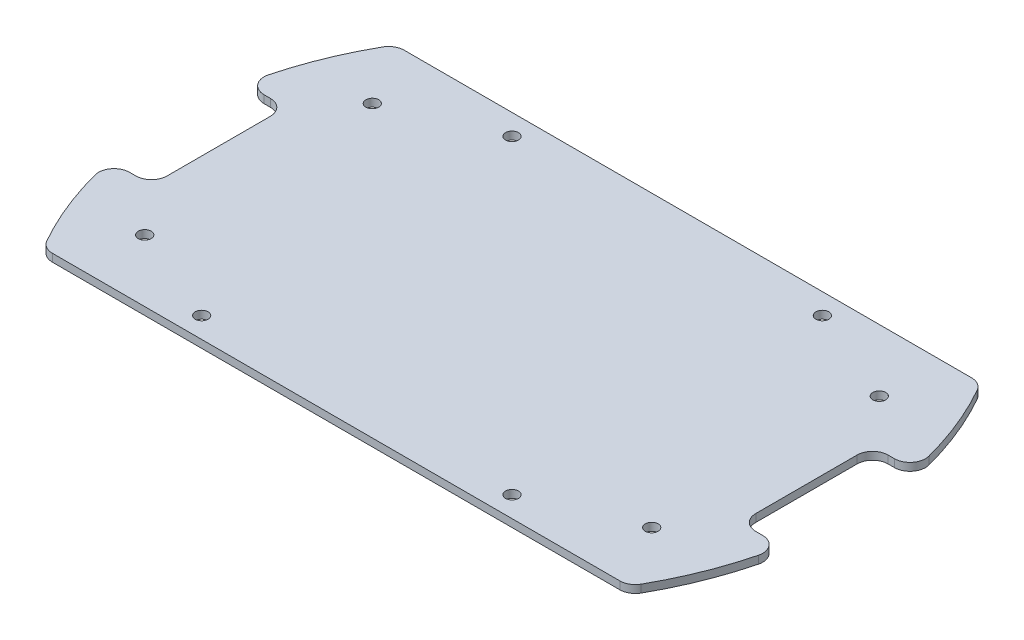
ISO-10303-21;
HEADER;
FILE_DESCRIPTION(('STEP AP214'),'2;1');
FILE_NAME('part.step','',(''),(''),'','','');
FILE_SCHEMA(('AUTOMOTIVE_DESIGN { 1 0 10303 214 1 1 1 1 }'));
ENDSEC;
DATA;
#1=APPLICATION_CONTEXT('core data for automotive mechanical design processes');
#2=APPLICATION_PROTOCOL_DEFINITION('international standard','automotive_design',2000,#1);
#3=PRODUCT_CONTEXT('',#1,'mechanical');
#4=PRODUCT('Part','Part','',(#3));
#5=PRODUCT_RELATED_PRODUCT_CATEGORY('part','',(#4));
#6=PRODUCT_DEFINITION_FORMATION('','',#4);
#7=PRODUCT_DEFINITION_CONTEXT('part definition',#1,'design');
#8=PRODUCT_DEFINITION('design','',#6,#7);
#9=PRODUCT_DEFINITION_SHAPE('','',#8);
#10=(LENGTH_UNIT() NAMED_UNIT(*) SI_UNIT(.MILLI.,.METRE.));
#11=(NAMED_UNIT(*) PLANE_ANGLE_UNIT() SI_UNIT($,.RADIAN.));
#12=(NAMED_UNIT(*) SI_UNIT($,.STERADIAN.) SOLID_ANGLE_UNIT());
#13=UNCERTAINTY_MEASURE_WITH_UNIT(LENGTH_MEASURE(1.E-05),#10,'distance_accuracy_value','');
#14=(GEOMETRIC_REPRESENTATION_CONTEXT(3) GLOBAL_UNCERTAINTY_ASSIGNED_CONTEXT((#13)) GLOBAL_UNIT_ASSIGNED_CONTEXT((#10,
#11,#12)) REPRESENTATION_CONTEXT('',''));
#15=CARTESIAN_POINT('',(0.,0.,0.));
#16=DIRECTION('',(0.,0.,1.));
#17=DIRECTION('',(1.,0.,0.));
#18=AXIS2_PLACEMENT_3D('',#15,#16,#17);
#19=CARTESIAN_POINT('',(-56.7070320753471,1.5,0.));
#20=DIRECTION('',(1.,0.,0.));
#21=DIRECTION('',(0.,0.,-1.));
#22=AXIS2_PLACEMENT_3D('',#19,#20,#21);
#23=PLANE('',#22);
#24=DIRECTION('',(0.,0.,1.));
#25=VECTOR('',#24,1.);
#26=CARTESIAN_POINT('',(-56.7070320753471,0.,0.));
#27=LINE('',#26,#25);
#28=CARTESIAN_POINT('',(-56.7070320753471,0.,-9.99999999999999));
#29=VERTEX_POINT('',#28);
#30=CARTESIAN_POINT('',(-56.7070320753471,0.,9.98328326306578));
#31=VERTEX_POINT('',#30);
#32=EDGE_CURVE('E327',#29,#31,#27,.T.);
#33=ORIENTED_EDGE('',*,*,#32,.T.);
#34=DIRECTION('',(0.,-1.,0.));
#35=VECTOR('',#34,1.);
#36=CARTESIAN_POINT('',(-56.7070320753471,1.5,9.98328326306578));
#37=LINE('',#36,#35);
#38=CARTESIAN_POINT('',(-56.7070320753471,1.5,9.98328326306578));
#39=VERTEX_POINT('',#38);
#40=EDGE_CURVE('E302',#31,#39,#37,.F.);
#41=ORIENTED_EDGE('',*,*,#40,.T.);
#42=DIRECTION('',(0.,0.,1.));
#43=VECTOR('',#42,1.);
#44=CARTESIAN_POINT('',(-56.7070320753471,1.5,0.));
#45=LINE('',#44,#43);
#46=CARTESIAN_POINT('',(-56.7070320753471,1.5,-9.99999999999999));
#47=VERTEX_POINT('',#46);
#48=EDGE_CURVE('E332',#47,#39,#45,.T.);
#49=ORIENTED_EDGE('',*,*,#48,.F.);
#50=DIRECTION('',(0.,-1.,0.));
#51=VECTOR('',#50,1.);
#52=CARTESIAN_POINT('',(-56.7070320753471,0.,-9.99999999999999));
#53=LINE('',#52,#51);
#54=EDGE_CURVE('E299',#47,#29,#53,.T.);
#55=ORIENTED_EDGE('',*,*,#54,.T.);
#56=EDGE_LOOP('',(#33,#41,#49,#55));
#57=FACE_BOUND('',#56,.T.);
#58=ADVANCED_FACE('F35',(#57),#23,.F.);
#59=CARTESIAN_POINT('',(0.0426976868972404,1.5,12.7837358563144));
#60=DIRECTION('',(-0.00333998208503997,0.,-0.99999442224428));
#61=DIRECTION('',(-0.99999442224428,0.,0.00333998208503997));
#62=AXIS2_PLACEMENT_3D('',#59,#60,#61);
#63=PLANE('',#62);
#64=DIRECTION('',(0.99999442224428,0.,-0.00333998208503997));
#65=VECTOR('',#64,1.);
#66=CARTESIAN_POINT('',(0.0426976868972404,0.,12.7837358563144));
#67=LINE('',#66,#65);
#68=CARTESIAN_POINT('',(-60.9477108585727,0.,12.987443864449));
#69=VERTEX_POINT('',#68);
#70=CARTESIAN_POINT('',(-59.697012129092,0.,12.9832665297986));
#71=VERTEX_POINT('',#70);
#72=EDGE_CURVE('E372',#69,#71,#67,.T.);
#73=ORIENTED_EDGE('',*,*,#72,.F.);
#74=DIRECTION('',(0.,1.,0.));
#75=VECTOR('',#74,1.);
#76=CARTESIAN_POINT('',(-60.9477108585727,1.5,12.987443864449));
#77=LINE('',#76,#75);
#78=CARTESIAN_POINT('',(-60.9477108585727,1.5,12.987443864449));
#79=VERTEX_POINT('',#78);
#80=EDGE_CURVE('E297',#69,#79,#77,.T.);
#81=ORIENTED_EDGE('',*,*,#80,.T.);
#82=DIRECTION('',(0.99999442224428,0.,-0.00333998208503997));
#83=VECTOR('',#82,1.);
#84=CARTESIAN_POINT('',(0.0426976868972404,1.5,12.7837358563144));
#85=LINE('',#84,#83);
#86=CARTESIAN_POINT('',(-59.697012129092,1.5,12.9832665297986));
#87=VERTEX_POINT('',#86);
#88=EDGE_CURVE('E344',#79,#87,#85,.T.);
#89=ORIENTED_EDGE('',*,*,#88,.T.);
#90=DIRECTION('',(0.,-1.,0.));
#91=VECTOR('',#90,1.);
#92=CARTESIAN_POINT('',(-59.697012129092,1.5,12.9832665297986));
#93=LINE('',#92,#91);
#94=EDGE_CURVE('E294',#87,#71,#93,.T.);
#95=ORIENTED_EDGE('',*,*,#94,.T.);
#96=EDGE_LOOP('',(#73,#81,#89,#95));
#97=FACE_BOUND('',#96,.T.);
#98=ADVANCED_FACE('F451',(#97),#63,.T.);
#99=CARTESIAN_POINT('',(0.,1.5,0.));
#100=DIRECTION('',(0.,-1.,0.));
#101=DIRECTION('',(0.,0.,-1.));
#102=AXIS2_PLACEMENT_3D('',#99,#100,#101);
#103=CYLINDRICAL_SURFACE('',#102,66.);
#104=CARTESIAN_POINT('',(0.,0.,0.));
#105=DIRECTION('',(0.,1.,0.));
#106=DIRECTION('',(0.,0.,1.));
#107=AXIS2_PLACEMENT_3D('',#104,#105,#106);
#108=CIRCLE('',#107,66.);
#109=CARTESIAN_POINT('',(-63.839485717666,0.,16.7487331850477));
#110=VERTEX_POINT('',#109);
#111=CARTESIAN_POINT('',(-57.4569147462183,0.,32.4761904761905));
#112=VERTEX_POINT('',#111);
#113=EDGE_CURVE('E376',#110,#112,#108,.T.);
#114=ORIENTED_EDGE('',*,*,#113,.T.);
#115=DIRECTION('',(0.,-1.,0.));
#116=VECTOR('',#115,1.);
#117=CARTESIAN_POINT('',(-57.4569147462183,1.5,32.4761904761905));
#118=LINE('',#117,#116);
#119=CARTESIAN_POINT('',(-57.4569147462183,1.5,32.4761904761905));
#120=VERTEX_POINT('',#119);
#121=EDGE_CURVE('E292',#112,#120,#118,.F.);
#122=ORIENTED_EDGE('',*,*,#121,.T.);
#123=CARTESIAN_POINT('',(0.,1.5,0.));
#124=DIRECTION('',(0.,1.,0.));
#125=DIRECTION('',(0.,0.,1.));
#126=AXIS2_PLACEMENT_3D('',#123,#124,#125);
#127=CIRCLE('',#126,66.);
#128=CARTESIAN_POINT('',(-63.839485717666,1.5,16.7487331850477));
#129=VERTEX_POINT('',#128);
#130=EDGE_CURVE('E347',#129,#120,#127,.T.);
#131=ORIENTED_EDGE('',*,*,#130,.F.);
#132=DIRECTION('',(0.,-1.,0.));
#133=VECTOR('',#132,1.);
#134=CARTESIAN_POINT('',(-63.839485717666,1.5,16.7487331850477));
#135=LINE('',#134,#133);
#136=EDGE_CURVE('E289',#129,#110,#135,.T.);
#137=ORIENTED_EDGE('',*,*,#136,.T.);
#138=EDGE_LOOP('',(#114,#122,#131,#137));
#139=FACE_BOUND('',#138,.T.);
#140=ADVANCED_FACE('F456',(#139),#103,.T.);
#141=CARTESIAN_POINT('',(0.,1.5,34.));
#142=DIRECTION('',(0.,0.,-1.));
#143=DIRECTION('',(-1.,0.,0.));
#144=AXIS2_PLACEMENT_3D('',#141,#142,#143);
#145=PLANE('',#144);
#146=DIRECTION('',(1.,0.,0.));
#147=VECTOR('',#146,1.);
#148=CARTESIAN_POINT('',(0.,0.,34.));
#149=LINE('',#148,#147);
#150=CARTESIAN_POINT('',(-54.8452368032084,0.,34.));
#151=VERTEX_POINT('',#150);
#152=CARTESIAN_POINT('',(54.8452368032084,0.,34.));
#153=VERTEX_POINT('',#152);
#154=EDGE_CURVE('E380',#151,#153,#149,.T.);
#155=ORIENTED_EDGE('',*,*,#154,.T.);
#156=DIRECTION('',(0.,-1.,0.));
#157=VECTOR('',#156,1.);
#158=CARTESIAN_POINT('',(54.8452368032084,1.5,34.));
#159=LINE('',#158,#157);
#160=CARTESIAN_POINT('',(54.8452368032084,1.5,34.));
#161=VERTEX_POINT('',#160);
#162=EDGE_CURVE('E287',#153,#161,#159,.F.);
#163=ORIENTED_EDGE('',*,*,#162,.T.);
#164=DIRECTION('',(1.,0.,0.));
#165=VECTOR('',#164,1.);
#166=CARTESIAN_POINT('',(0.,1.5,34.));
#167=LINE('',#166,#165);
#168=CARTESIAN_POINT('',(-54.8452368032084,1.5,34.));
#169=VERTEX_POINT('',#168);
#170=EDGE_CURVE('E359',#169,#161,#167,.T.);
#171=ORIENTED_EDGE('',*,*,#170,.F.);
#172=DIRECTION('',(0.,-1.,0.));
#173=VECTOR('',#172,1.);
#174=CARTESIAN_POINT('',(-54.8452368032084,1.5,34.));
#175=LINE('',#174,#173);
#176=EDGE_CURVE('E284',#169,#151,#175,.T.);
#177=ORIENTED_EDGE('',*,*,#176,.T.);
#178=EDGE_LOOP('',(#155,#163,#171,#177));
#179=FACE_BOUND('',#178,.T.);
#180=ADVANCED_FACE('F552',(#179),#145,.F.);
#181=CARTESIAN_POINT('',(0.,1.5,0.));
#182=DIRECTION('',(0.,-1.,0.));
#183=DIRECTION('',(0.,0.,-1.));
#184=AXIS2_PLACEMENT_3D('',#181,#182,#183);
#185=CYLINDRICAL_SURFACE('',#184,66.);
#186=CARTESIAN_POINT('',(0.,0.,0.));
#187=DIRECTION('',(0.,1.,0.));
#188=DIRECTION('',(0.,0.,1.));
#189=AXIS2_PLACEMENT_3D('',#186,#187,#188);
#190=CIRCLE('',#189,66.);
#191=CARTESIAN_POINT('',(57.4569147462183,0.,32.4761904761905));
#192=VERTEX_POINT('',#191);
#193=CARTESIAN_POINT('',(63.9499417109376,0.,16.3219164060989));
#194=VERTEX_POINT('',#193);
#195=EDGE_CURVE('E383',#192,#194,#190,.T.);
#196=ORIENTED_EDGE('',*,*,#195,.T.);
#197=DIRECTION('',(0.,-1.,0.));
#198=VECTOR('',#197,1.);
#199=CARTESIAN_POINT('',(63.9499417109376,1.5,16.3219164060989));
#200=LINE('',#199,#198);
#201=CARTESIAN_POINT('',(63.9499417109376,1.5,16.3219164060989));
#202=VERTEX_POINT('',#201);
#203=EDGE_CURVE('E282',#194,#202,#200,.F.);
#204=ORIENTED_EDGE('',*,*,#203,.T.);
#205=CARTESIAN_POINT('',(0.,1.5,0.));
#206=DIRECTION('',(0.,1.,0.));
#207=DIRECTION('',(0.,0.,1.));
#208=AXIS2_PLACEMENT_3D('',#205,#206,#207);
#209=CIRCLE('',#208,66.);
#210=CARTESIAN_POINT('',(57.4569147462183,1.5,32.4761904761905));
#211=VERTEX_POINT('',#210);
#212=EDGE_CURVE('E356',#211,#202,#209,.T.);
#213=ORIENTED_EDGE('',*,*,#212,.F.);
#214=DIRECTION('',(0.,-1.,0.));
#215=VECTOR('',#214,1.);
#216=CARTESIAN_POINT('',(57.4569147462183,1.5,32.4761904761905));
#217=LINE('',#216,#215);
#218=EDGE_CURVE('E279',#211,#192,#217,.T.);
#219=ORIENTED_EDGE('',*,*,#218,.T.);
#220=EDGE_LOOP('',(#196,#204,#213,#219));
#221=FACE_BOUND('',#220,.T.);
#222=ADVANCED_FACE('F545',(#221),#185,.T.);
#223=CARTESIAN_POINT('',(59.7170520216022,0.,12.5844234701843));
#224=VERTEX_POINT('',#223);
#225=CARTESIAN_POINT('',(61.0331062323672,0.,12.5800278481797));
#226=VERTEX_POINT('',#225);
#227=EDGE_CURVE('E377',#224,#226,#67,.T.);
#228=ORIENTED_EDGE('',*,*,#227,.F.);
#229=DIRECTION('',(0.,-1.,0.));
#230=VECTOR('',#229,1.);
#231=CARTESIAN_POINT('',(59.7170520216022,1.5,12.5844234701843));
#232=LINE('',#231,#230);
#233=CARTESIAN_POINT('',(59.7170520216022,1.5,12.5844234701843));
#234=VERTEX_POINT('',#233);
#235=EDGE_CURVE('E277',#224,#234,#232,.F.);
#236=ORIENTED_EDGE('',*,*,#235,.T.);
#237=CARTESIAN_POINT('',(61.0331062323672,1.5,12.5800278481797));
#238=VERTEX_POINT('',#237);
#239=EDGE_CURVE('E349',#234,#238,#85,.T.);
#240=ORIENTED_EDGE('',*,*,#239,.T.);
#241=DIRECTION('',(0.,1.,0.));
#242=VECTOR('',#241,1.);
#243=CARTESIAN_POINT('',(61.0331062323672,0.,12.5800278481797));
#244=LINE('',#243,#242);
#245=EDGE_CURVE('E274',#238,#226,#244,.F.);
#246=ORIENTED_EDGE('',*,*,#245,.T.);
#247=EDGE_LOOP('',(#228,#236,#240,#246));
#248=FACE_BOUND('',#247,.T.);
#249=ADVANCED_FACE('F459',(#248),#63,.T.);
#250=CARTESIAN_POINT('',(56.7070320753471,1.5,0.));
#251=DIRECTION('',(1.,0.,0.));
#252=DIRECTION('',(0.,0.,-1.));
#253=AXIS2_PLACEMENT_3D('',#250,#251,#252);
#254=PLANE('',#253);
#255=DIRECTION('',(0.,0.,1.));
#256=VECTOR('',#255,1.);
#257=CARTESIAN_POINT('',(56.7070320753471,0.,0.));
#258=LINE('',#257,#256);
#259=CARTESIAN_POINT('',(56.7070320753471,0.,-9.99999999999999));
#260=VERTEX_POINT('',#259);
#261=CARTESIAN_POINT('',(56.7070320753471,0.,9.58444020345149));
#262=VERTEX_POINT('',#261);
#263=EDGE_CURVE('E386',#260,#262,#258,.T.);
#264=ORIENTED_EDGE('',*,*,#263,.F.);
#265=DIRECTION('',(0.,-1.,0.));
#266=VECTOR('',#265,1.);
#267=CARTESIAN_POINT('',(56.7070320753471,1.5,-9.99999999999999));
#268=LINE('',#267,#266);
#269=CARTESIAN_POINT('',(56.7070320753471,1.5,-9.99999999999999));
#270=VERTEX_POINT('',#269);
#271=EDGE_CURVE('E272',#260,#270,#268,.F.);
#272=ORIENTED_EDGE('',*,*,#271,.T.);
#273=DIRECTION('',(0.,0.,1.));
#274=VECTOR('',#273,1.);
#275=CARTESIAN_POINT('',(56.7070320753471,1.5,0.));
#276=LINE('',#275,#274);
#277=CARTESIAN_POINT('',(56.7070320753471,1.5,9.58444020345149));
#278=VERTEX_POINT('',#277);
#279=EDGE_CURVE('E355',#270,#278,#276,.T.);
#280=ORIENTED_EDGE('',*,*,#279,.T.);
#281=DIRECTION('',(0.,-1.,0.));
#282=VECTOR('',#281,1.);
#283=CARTESIAN_POINT('',(56.7070320753471,0.,9.58444020345149));
#284=LINE('',#283,#282);
#285=EDGE_CURVE('E269',#278,#262,#284,.T.);
#286=ORIENTED_EDGE('',*,*,#285,.T.);
#287=EDGE_LOOP('',(#264,#272,#280,#286));
#288=FACE_BOUND('',#287,.T.);
#289=ADVANCED_FACE('F531',(#288),#254,.T.);
#290=CARTESIAN_POINT('',(0.,1.5,-13.));
#291=DIRECTION('',(0.,0.,-1.));
#292=DIRECTION('',(-1.,0.,0.));
#293=AXIS2_PLACEMENT_3D('',#290,#291,#292);
#294=PLANE('',#293);
#295=DIRECTION('',(1.,0.,0.));
#296=VECTOR('',#295,1.);
#297=CARTESIAN_POINT('',(0.,0.,-13.));
#298=LINE('',#297,#296);
#299=CARTESIAN_POINT('',(59.7070320753471,0.,-13.));
#300=VERTEX_POINT('',#299);
#301=CARTESIAN_POINT('',(60.9343909463285,0.,-13.));
#302=VERTEX_POINT('',#301);
#303=EDGE_CURVE('E334',#300,#302,#298,.T.);
#304=ORIENTED_EDGE('',*,*,#303,.T.);
#305=DIRECTION('',(0.,-1.,0.));
#306=VECTOR('',#305,1.);
#307=CARTESIAN_POINT('',(60.9343909463285,1.5,-13.));
#308=LINE('',#307,#306);
#309=CARTESIAN_POINT('',(60.9343909463285,1.5,-13.));
#310=VERTEX_POINT('',#309);
#311=EDGE_CURVE('E267',#302,#310,#308,.F.);
#312=ORIENTED_EDGE('',*,*,#311,.T.);
#313=DIRECTION('',(1.,0.,0.));
#314=VECTOR('',#313,1.);
#315=CARTESIAN_POINT('',(0.,1.5,-13.));
#316=LINE('',#315,#314);
#317=CARTESIAN_POINT('',(59.7070320753471,1.5,-13.));
#318=VERTEX_POINT('',#317);
#319=EDGE_CURVE('E228',#318,#310,#316,.T.);
#320=ORIENTED_EDGE('',*,*,#319,.F.);
#321=DIRECTION('',(0.,-1.,0.));
#322=VECTOR('',#321,1.);
#323=CARTESIAN_POINT('',(59.7070320753471,1.5,-13.));
#324=LINE('',#323,#322);
#325=EDGE_CURVE('E264',#318,#300,#324,.T.);
#326=ORIENTED_EDGE('',*,*,#325,.T.);
#327=EDGE_LOOP('',(#304,#312,#320,#326));
#328=FACE_BOUND('',#327,.T.);
#329=ADVANCED_FACE('F523',(#328),#294,.F.);
#330=CARTESIAN_POINT('',(0.,1.5,0.));
#331=DIRECTION('',(0.,-1.,0.));
#332=DIRECTION('',(0.,0.,-1.));
#333=AXIS2_PLACEMENT_3D('',#330,#331,#332);
#334=CYLINDRICAL_SURFACE('',#333,66.);
#335=CARTESIAN_POINT('',(0.,0.,0.));
#336=DIRECTION('',(0.,1.,0.));
#337=DIRECTION('',(0.,0.,1.));
#338=AXIS2_PLACEMENT_3D('',#335,#336,#337);
#339=CIRCLE('',#338,66.);
#340=CARTESIAN_POINT('',(63.8360286104394,0.,-16.7619047619048));
#341=VERTEX_POINT('',#340);
#342=CARTESIAN_POINT('',(57.4569147462183,0.,-32.4761904761905));
#343=VERTEX_POINT('',#342);
#344=EDGE_CURVE('E218',#341,#343,#339,.T.);
#345=ORIENTED_EDGE('',*,*,#344,.T.);
#346=DIRECTION('',(0.,-1.,0.));
#347=VECTOR('',#346,1.);
#348=CARTESIAN_POINT('',(57.4569147462183,1.5,-32.4761904761905));
#349=LINE('',#348,#347);
#350=CARTESIAN_POINT('',(57.4569147462183,1.5,-32.4761904761905));
#351=VERTEX_POINT('',#350);
#352=EDGE_CURVE('E248',#343,#351,#349,.F.);
#353=ORIENTED_EDGE('',*,*,#352,.T.);
#354=CARTESIAN_POINT('',(0.,1.5,0.));
#355=DIRECTION('',(0.,1.,0.));
#356=DIRECTION('',(0.,0.,1.));
#357=AXIS2_PLACEMENT_3D('',#354,#355,#356);
#358=CIRCLE('',#357,66.);
#359=CARTESIAN_POINT('',(63.8360286104394,1.5,-16.7619047619048));
#360=VERTEX_POINT('',#359);
#361=EDGE_CURVE('E366',#360,#351,#358,.T.);
#362=ORIENTED_EDGE('',*,*,#361,.F.);
#363=DIRECTION('',(0.,-1.,0.));
#364=VECTOR('',#363,1.);
#365=CARTESIAN_POINT('',(63.8360286104394,1.5,-16.7619047619048));
#366=LINE('',#365,#364);
#367=EDGE_CURVE('E245',#360,#341,#366,.T.);
#368=ORIENTED_EDGE('',*,*,#367,.T.);
#369=EDGE_LOOP('',(#345,#353,#362,#368));
#370=FACE_BOUND('',#369,.T.);
#371=ADVANCED_FACE('F516',(#370),#334,.T.);
#372=CARTESIAN_POINT('',(0.,1.5,-34.));
#373=DIRECTION('',(0.,0.,-1.));
#374=DIRECTION('',(-1.,0.,0.));
#375=AXIS2_PLACEMENT_3D('',#372,#373,#374);
#376=PLANE('',#375);
#377=DIRECTION('',(1.,0.,0.));
#378=VECTOR('',#377,1.);
#379=CARTESIAN_POINT('',(0.,1.5,-34.));
#380=LINE('',#379,#378);
#381=CARTESIAN_POINT('',(-54.8452368032084,1.5,-34.));
#382=VERTEX_POINT('',#381);
#383=CARTESIAN_POINT('',(54.8452368032084,1.5,-34.));
#384=VERTEX_POINT('',#383);
#385=EDGE_CURVE('E368',#382,#384,#380,.T.);
#386=ORIENTED_EDGE('',*,*,#385,.T.);
#387=DIRECTION('',(0.,1.,0.));
#388=VECTOR('',#387,1.);
#389=CARTESIAN_POINT('',(54.8452368032084,0.,-34.));
#390=LINE('',#389,#388);
#391=CARTESIAN_POINT('',(54.8452368032084,0.,-34.));
#392=VERTEX_POINT('',#391);
#393=EDGE_CURVE('E217',#384,#392,#390,.F.);
#394=ORIENTED_EDGE('',*,*,#393,.T.);
#395=DIRECTION('',(1.,0.,0.));
#396=VECTOR('',#395,1.);
#397=CARTESIAN_POINT('',(0.,0.,-34.));
#398=LINE('',#397,#396);
#399=CARTESIAN_POINT('',(-54.8452368032084,0.,-34.));
#400=VERTEX_POINT('',#399);
#401=EDGE_CURVE('E200',#400,#392,#398,.T.);
#402=ORIENTED_EDGE('',*,*,#401,.F.);
#403=DIRECTION('',(0.,1.,0.));
#404=VECTOR('',#403,1.);
#405=CARTESIAN_POINT('',(-54.8452368032084,1.5,-34.));
#406=LINE('',#405,#404);
#407=EDGE_CURVE('E214',#400,#382,#406,.T.);
#408=ORIENTED_EDGE('',*,*,#407,.T.);
#409=EDGE_LOOP('',(#386,#394,#402,#408));
#410=FACE_BOUND('',#409,.T.);
#411=ADVANCED_FACE('F213',(#410),#376,.T.);
#412=CARTESIAN_POINT('',(0.,1.5,0.));
#413=DIRECTION('',(0.,-1.,0.));
#414=DIRECTION('',(0.,0.,-1.));
#415=AXIS2_PLACEMENT_3D('',#412,#413,#414);
#416=CYLINDRICAL_SURFACE('',#415,66.);
#417=CARTESIAN_POINT('',(0.,1.5,0.));
#418=DIRECTION('',(0.,1.,0.));
#419=DIRECTION('',(0.,0.,1.));
#420=AXIS2_PLACEMENT_3D('',#417,#418,#419);
#421=CIRCLE('',#420,66.);
#422=CARTESIAN_POINT('',(-57.4569147462183,1.5,-32.4761904761905));
#423=VERTEX_POINT('',#422);
#424=CARTESIAN_POINT('',(-63.8360286104394,1.5,-16.7619047619048));
#425=VERTEX_POINT('',#424);
#426=EDGE_CURVE('E226',#423,#425,#421,.T.);
#427=ORIENTED_EDGE('',*,*,#426,.F.);
#428=DIRECTION('',(0.,-1.,0.));
#429=VECTOR('',#428,1.);
#430=CARTESIAN_POINT('',(-57.4569147462183,1.5,-32.4761904761905));
#431=LINE('',#430,#429);
#432=CARTESIAN_POINT('',(-57.4569147462183,0.,-32.4761904761905));
#433=VERTEX_POINT('',#432);
#434=EDGE_CURVE('E310',#423,#433,#431,.T.);
#435=ORIENTED_EDGE('',*,*,#434,.T.);
#436=CARTESIAN_POINT('',(0.,0.,0.));
#437=DIRECTION('',(0.,1.,0.));
#438=DIRECTION('',(0.,0.,1.));
#439=AXIS2_PLACEMENT_3D('',#436,#437,#438);
#440=CIRCLE('',#439,66.);
#441=CARTESIAN_POINT('',(-63.8360286104394,0.,-16.7619047619048));
#442=VERTEX_POINT('',#441);
#443=EDGE_CURVE('E202',#433,#442,#440,.T.);
#444=ORIENTED_EDGE('',*,*,#443,.T.);
#445=DIRECTION('',(0.,-1.,0.));
#446=VECTOR('',#445,1.);
#447=CARTESIAN_POINT('',(-63.8360286104394,1.5,-16.7619047619048));
#448=LINE('',#447,#446);
#449=EDGE_CURVE('E308',#442,#425,#448,.F.);
#450=ORIENTED_EDGE('',*,*,#449,.T.);
#451=EDGE_LOOP('',(#427,#435,#444,#450));
#452=FACE_BOUND('',#451,.T.);
#453=ADVANCED_FACE('F511',(#452),#416,.T.);
#454=CARTESIAN_POINT('',(-60.9343909463285,0.,-13.));
#455=VERTEX_POINT('',#454);
#456=CARTESIAN_POINT('',(-59.7070320753471,0.,-13.));
#457=VERTEX_POINT('',#456);
#458=EDGE_CURVE('E325',#455,#457,#298,.T.);
#459=ORIENTED_EDGE('',*,*,#458,.T.);
#460=DIRECTION('',(0.,-1.,0.));
#461=VECTOR('',#460,1.);
#462=CARTESIAN_POINT('',(-59.7070320753471,1.5,-13.));
#463=LINE('',#462,#461);
#464=CARTESIAN_POINT('',(-59.7070320753471,1.5,-13.));
#465=VERTEX_POINT('',#464);
#466=EDGE_CURVE('E50',#457,#465,#463,.F.);
#467=ORIENTED_EDGE('',*,*,#466,.T.);
#468=CARTESIAN_POINT('',(-60.9343909463285,1.5,-13.));
#469=VERTEX_POINT('',#468);
#470=EDGE_CURVE('E223',#469,#465,#316,.T.);
#471=ORIENTED_EDGE('',*,*,#470,.F.);
#472=DIRECTION('',(0.,-1.,0.));
#473=VECTOR('',#472,1.);
#474=CARTESIAN_POINT('',(-60.9343909463285,1.5,-13.));
#475=LINE('',#474,#473);
#476=EDGE_CURVE('E304',#469,#455,#475,.T.);
#477=ORIENTED_EDGE('',*,*,#476,.T.);
#478=EDGE_LOOP('',(#459,#467,#471,#477));
#479=FACE_BOUND('',#478,.T.);
#480=ADVANCED_FACE('F330',(#479),#294,.F.);
#481=CARTESIAN_POINT('',(0.,1.5,0.));
#482=DIRECTION('',(0.,1.,0.));
#483=DIRECTION('',(0.,0.,1.));
#484=AXIS2_PLACEMENT_3D('',#481,#482,#483);
#485=PLANE('',#484);
#486=CARTESIAN_POINT('',(49.,1.5,22.));
#487=DIRECTION('',(0.,1.,0.));
#488=DIRECTION('',(0.,0.,1.));
#489=AXIS2_PLACEMENT_3D('',#486,#487,#488);
#490=CIRCLE('',#489,1.25);
#491=CARTESIAN_POINT('',(49.,1.5,23.25));
#492=VERTEX_POINT('',#491);
#493=EDGE_CURVE('E793',#492,#492,#490,.T.);
#494=ORIENTED_EDGE('',*,*,#493,.F.);
#495=EDGE_LOOP('',(#494));
#496=FACE_BOUND('',#495,.T.);
#497=CARTESIAN_POINT('',(49.,1.5,-22.));
#498=DIRECTION('',(0.,1.,0.));
#499=DIRECTION('',(0.,0.,1.));
#500=AXIS2_PLACEMENT_3D('',#497,#498,#499);
#501=CIRCLE('',#500,1.25);
#502=CARTESIAN_POINT('',(49.,1.5,-20.75));
#503=VERTEX_POINT('',#502);
#504=EDGE_CURVE('E786',#503,#503,#501,.T.);
#505=ORIENTED_EDGE('',*,*,#504,.F.);
#506=EDGE_LOOP('',(#505));
#507=FACE_BOUND('',#506,.T.);
#508=CARTESIAN_POINT('',(-49.,1.5,22.));
#509=DIRECTION('',(0.,1.,0.));
#510=DIRECTION('',(0.,0.,1.));
#511=AXIS2_PLACEMENT_3D('',#508,#509,#510);
#512=CIRCLE('',#511,1.25);
#513=CARTESIAN_POINT('',(-49.,1.5,23.25));
#514=VERTEX_POINT('',#513);
#515=EDGE_CURVE('E415',#514,#514,#512,.T.);
#516=ORIENTED_EDGE('',*,*,#515,.F.);
#517=EDGE_LOOP('',(#516));
#518=FACE_BOUND('',#517,.T.);
#519=CARTESIAN_POINT('',(-49.,1.5,-22.));
#520=DIRECTION('',(0.,1.,0.));
#521=DIRECTION('',(0.,0.,1.));
#522=AXIS2_PLACEMENT_3D('',#519,#520,#521);
#523=CIRCLE('',#522,1.25);
#524=CARTESIAN_POINT('',(-49.,1.5,-20.75));
#525=VERTEX_POINT('',#524);
#526=EDGE_CURVE('E405',#525,#525,#523,.T.);
#527=ORIENTED_EDGE('',*,*,#526,.F.);
#528=EDGE_LOOP('',(#527));
#529=FACE_BOUND('',#528,.T.);
#530=CARTESIAN_POINT('',(-30.,1.5,-30.));
#531=DIRECTION('',(0.,1.,0.));
#532=DIRECTION('',(0.,0.,1.));
#533=AXIS2_PLACEMENT_3D('',#530,#531,#532);
#534=CIRCLE('',#533,1.25);
#535=CARTESIAN_POINT('',(-30.,1.5,-28.75));
#536=VERTEX_POINT('',#535);
#537=EDGE_CURVE('E402',#536,#536,#534,.T.);
#538=ORIENTED_EDGE('',*,*,#537,.F.);
#539=EDGE_LOOP('',(#538));
#540=FACE_BOUND('',#539,.T.);
#541=CARTESIAN_POINT('',(-29.9999999999983,1.5,30.));
#542=DIRECTION('',(0.,1.,0.));
#543=DIRECTION('',(0.,0.,1.));
#544=AXIS2_PLACEMENT_3D('',#541,#542,#543);
#545=CIRCLE('',#544,1.25);
#546=CARTESIAN_POINT('',(-29.9999999999983,1.5,31.25));
#547=VERTEX_POINT('',#546);
#548=EDGE_CURVE('E401',#547,#547,#545,.T.);
#549=ORIENTED_EDGE('',*,*,#548,.F.);
#550=EDGE_LOOP('',(#549));
#551=FACE_BOUND('',#550,.T.);
#552=CARTESIAN_POINT('',(30.,1.5,-30.0000000000017));
#553=DIRECTION('',(0.,1.,0.));
#554=DIRECTION('',(0.,0.,1.));
#555=AXIS2_PLACEMENT_3D('',#552,#553,#554);
#556=CIRCLE('',#555,1.25);
#557=CARTESIAN_POINT('',(30.,1.5,-28.7500000000017));
#558=VERTEX_POINT('',#557);
#559=EDGE_CURVE('E398',#558,#558,#556,.T.);
#560=ORIENTED_EDGE('',*,*,#559,.F.);
#561=EDGE_LOOP('',(#560));
#562=FACE_BOUND('',#561,.T.);
#563=CARTESIAN_POINT('',(30.0000000000017,1.5,29.9999999999983));
#564=DIRECTION('',(0.,1.,0.));
#565=DIRECTION('',(0.,0.,1.));
#566=AXIS2_PLACEMENT_3D('',#563,#564,#565);
#567=CIRCLE('',#566,1.25);
#568=CARTESIAN_POINT('',(30.0000000000017,1.5,31.2499999999983));
#569=VERTEX_POINT('',#568);
#570=EDGE_CURVE('E351',#569,#569,#567,.T.);
#571=ORIENTED_EDGE('',*,*,#570,.F.);
#572=EDGE_LOOP('',(#571));
#573=FACE_BOUND('',#572,.T.);
#574=ORIENTED_EDGE('',*,*,#361,.T.);
#575=CARTESIAN_POINT('',(54.8452368032084,1.5,-31.));
#576=DIRECTION('',(0.,1.,0.));
#577=DIRECTION('',(0.,0.,1.));
#578=AXIS2_PLACEMENT_3D('',#575,#576,#577);
#579=CIRCLE('',#578,3.);
#580=EDGE_CURVE('E262',#351,#384,#579,.T.);
#581=ORIENTED_EDGE('',*,*,#580,.T.);
#582=ORIENTED_EDGE('',*,*,#385,.F.);
#583=CARTESIAN_POINT('',(-54.8452368032084,1.5,-31.));
#584=DIRECTION('',(0.,1.,0.));
#585=DIRECTION('',(0.,0.,1.));
#586=AXIS2_PLACEMENT_3D('',#583,#584,#585);
#587=CIRCLE('',#586,3.);
#588=EDGE_CURVE('E222',#382,#423,#587,.T.);
#589=ORIENTED_EDGE('',*,*,#588,.T.);
#590=ORIENTED_EDGE('',*,*,#426,.T.);
#591=CARTESIAN_POINT('',(-60.9343909463285,1.5,-16.));
#592=DIRECTION('',(0.,1.,0.));
#593=DIRECTION('',(0.,0.,1.));
#594=AXIS2_PLACEMENT_3D('',#591,#592,#593);
#595=CIRCLE('',#594,3.);
#596=EDGE_CURVE('E57',#425,#469,#595,.T.);
#597=ORIENTED_EDGE('',*,*,#596,.T.);
#598=ORIENTED_EDGE('',*,*,#470,.T.);
#599=CARTESIAN_POINT('',(-59.7070320753471,1.5,-9.99999999999999));
#600=DIRECTION('',(0.,1.,0.));
#601=DIRECTION('',(0.,0.,1.));
#602=AXIS2_PLACEMENT_3D('',#599,#600,#601);
#603=CIRCLE('',#602,3.);
#604=EDGE_CURVE('E11',#465,#47,#603,.F.);
#605=ORIENTED_EDGE('',*,*,#604,.T.);
#606=ORIENTED_EDGE('',*,*,#48,.T.);
#607=CARTESIAN_POINT('',(-59.7070320753471,1.5,9.98328326306578));
#608=DIRECTION('',(0.,1.,0.));
#609=DIRECTION('',(0.,0.,1.));
#610=AXIS2_PLACEMENT_3D('',#607,#608,#609);
#611=CIRCLE('',#610,3.);
#612=EDGE_CURVE('E322',#39,#87,#611,.F.);
#613=ORIENTED_EDGE('',*,*,#612,.T.);
#614=ORIENTED_EDGE('',*,*,#88,.F.);
#615=CARTESIAN_POINT('',(-60.9376909123176,1.5,15.9874271311819));
#616=DIRECTION('',(0.,1.,0.));
#617=DIRECTION('',(0.,0.,1.));
#618=AXIS2_PLACEMENT_3D('',#615,#616,#617);
#619=CIRCLE('',#618,3.);
#620=EDGE_CURVE('E252',#79,#129,#619,.T.);
#621=ORIENTED_EDGE('',*,*,#620,.T.);
#622=ORIENTED_EDGE('',*,*,#130,.T.);
#623=CARTESIAN_POINT('',(-54.8452368032084,1.5,31.));
#624=DIRECTION('',(0.,1.,0.));
#625=DIRECTION('',(0.,0.,1.));
#626=AXIS2_PLACEMENT_3D('',#623,#624,#625);
#627=CIRCLE('',#626,3.);
#628=EDGE_CURVE('E254',#120,#169,#627,.T.);
#629=ORIENTED_EDGE('',*,*,#628,.T.);
#630=ORIENTED_EDGE('',*,*,#170,.T.);
#631=CARTESIAN_POINT('',(54.8452368032084,1.5,31.));
#632=DIRECTION('',(0.,1.,0.));
#633=DIRECTION('',(0.,0.,1.));
#634=AXIS2_PLACEMENT_3D('',#631,#632,#633);
#635=CIRCLE('',#634,3.);
#636=EDGE_CURVE('E256',#161,#211,#635,.T.);
#637=ORIENTED_EDGE('',*,*,#636,.T.);
#638=ORIENTED_EDGE('',*,*,#212,.T.);
#639=CARTESIAN_POINT('',(61.0431261786223,1.5,15.5800111149126));
#640=DIRECTION('',(0.,1.,0.));
#641=DIRECTION('',(0.,0.,1.));
#642=AXIS2_PLACEMENT_3D('',#639,#640,#641);
#643=CIRCLE('',#642,3.);
#644=EDGE_CURVE('E258',#202,#238,#643,.T.);
#645=ORIENTED_EDGE('',*,*,#644,.T.);
#646=ORIENTED_EDGE('',*,*,#239,.F.);
#647=CARTESIAN_POINT('',(59.7070320753471,1.5,9.58444020345149));
#648=DIRECTION('',(0.,1.,0.));
#649=DIRECTION('',(0.,0.,1.));
#650=AXIS2_PLACEMENT_3D('',#647,#648,#649);
#651=CIRCLE('',#650,3.);
#652=EDGE_CURVE('E318',#234,#278,#651,.F.);
#653=ORIENTED_EDGE('',*,*,#652,.T.);
#654=ORIENTED_EDGE('',*,*,#279,.F.);
#655=CARTESIAN_POINT('',(59.7070320753471,1.5,-9.99999999999999));
#656=DIRECTION('',(0.,1.,0.));
#657=DIRECTION('',(0.,0.,1.));
#658=AXIS2_PLACEMENT_3D('',#655,#656,#657);
#659=CIRCLE('',#658,3.);
#660=EDGE_CURVE('E314',#270,#318,#659,.F.);
#661=ORIENTED_EDGE('',*,*,#660,.T.);
#662=ORIENTED_EDGE('',*,*,#319,.T.);
#663=CARTESIAN_POINT('',(60.9343909463285,1.5,-16.));
#664=DIRECTION('',(0.,1.,0.));
#665=DIRECTION('',(0.,0.,1.));
#666=AXIS2_PLACEMENT_3D('',#663,#664,#665);
#667=CIRCLE('',#666,3.);
#668=EDGE_CURVE('E260',#310,#360,#667,.T.);
#669=ORIENTED_EDGE('',*,*,#668,.T.);
#670=EDGE_LOOP('',(#574,#581,#582,#589,#590,#597,#598,#605,#606,#613,#614,#621,#622,#629,#630,
#637,#638,#645,#646,#653,#654,#661,#662,#669));
#671=FACE_BOUND('',#670,.T.);
#672=ADVANCED_FACE('F340',(#496,#507,#518,#529,#540,#551,#562,#573,#671),#485,.T.);
#673=CARTESIAN_POINT('',(0.,0.,0.));
#674=DIRECTION('',(0.,1.,0.));
#675=DIRECTION('',(0.,0.,1.));
#676=AXIS2_PLACEMENT_3D('',#673,#674,#675);
#677=PLANE('',#676);
#678=CARTESIAN_POINT('',(49.,0.,22.));
#679=DIRECTION('',(0.,1.,0.));
#680=DIRECTION('',(0.,0.,1.));
#681=AXIS2_PLACEMENT_3D('',#678,#679,#680);
#682=CIRCLE('',#681,1.25);
#683=CARTESIAN_POINT('',(49.,0.,23.25));
#684=VERTEX_POINT('',#683);
#685=EDGE_CURVE('E789',#684,#684,#682,.T.);
#686=ORIENTED_EDGE('',*,*,#685,.T.);
#687=EDGE_LOOP('',(#686));
#688=FACE_BOUND('',#687,.T.);
#689=CARTESIAN_POINT('',(49.,0.,-22.));
#690=DIRECTION('',(0.,1.,0.));
#691=DIRECTION('',(0.,0.,1.));
#692=AXIS2_PLACEMENT_3D('',#689,#690,#691);
#693=CIRCLE('',#692,1.25);
#694=CARTESIAN_POINT('',(49.,0.,-20.75));
#695=VERTEX_POINT('',#694);
#696=EDGE_CURVE('E784',#695,#695,#693,.T.);
#697=ORIENTED_EDGE('',*,*,#696,.T.);
#698=EDGE_LOOP('',(#697));
#699=FACE_BOUND('',#698,.T.);
#700=CARTESIAN_POINT('',(-49.,0.,22.));
#701=DIRECTION('',(0.,1.,0.));
#702=DIRECTION('',(0.,0.,1.));
#703=AXIS2_PLACEMENT_3D('',#700,#701,#702);
#704=CIRCLE('',#703,1.25);
#705=CARTESIAN_POINT('',(-49.,0.,23.25));
#706=VERTEX_POINT('',#705);
#707=EDGE_CURVE('E230',#706,#706,#704,.T.);
#708=ORIENTED_EDGE('',*,*,#707,.T.);
#709=EDGE_LOOP('',(#708));
#710=FACE_BOUND('',#709,.T.);
#711=CARTESIAN_POINT('',(-49.,0.,-22.));
#712=DIRECTION('',(0.,1.,0.));
#713=DIRECTION('',(0.,0.,1.));
#714=AXIS2_PLACEMENT_3D('',#711,#712,#713);
#715=CIRCLE('',#714,1.25);
#716=CARTESIAN_POINT('',(-49.,0.,-20.75));
#717=VERTEX_POINT('',#716);
#718=EDGE_CURVE('E403',#717,#717,#715,.T.);
#719=ORIENTED_EDGE('',*,*,#718,.T.);
#720=EDGE_LOOP('',(#719));
#721=FACE_BOUND('',#720,.T.);
#722=CARTESIAN_POINT('',(-30.,0.,-30.));
#723=DIRECTION('',(0.,1.,0.));
#724=DIRECTION('',(0.,0.,1.));
#725=AXIS2_PLACEMENT_3D('',#722,#723,#724);
#726=CIRCLE('',#725,1.25);
#727=CARTESIAN_POINT('',(-30.,0.,-28.75));
#728=VERTEX_POINT('',#727);
#729=EDGE_CURVE('E399',#728,#728,#726,.T.);
#730=ORIENTED_EDGE('',*,*,#729,.T.);
#731=EDGE_LOOP('',(#730));
#732=FACE_BOUND('',#731,.T.);
#733=CARTESIAN_POINT('',(-29.9999999999983,0.,30.));
#734=DIRECTION('',(0.,1.,0.));
#735=DIRECTION('',(0.,0.,1.));
#736=AXIS2_PLACEMENT_3D('',#733,#734,#735);
#737=CIRCLE('',#736,1.25);
#738=CARTESIAN_POINT('',(-29.9999999999983,0.,31.25));
#739=VERTEX_POINT('',#738);
#740=EDGE_CURVE('E421',#739,#739,#737,.T.);
#741=ORIENTED_EDGE('',*,*,#740,.T.);
#742=EDGE_LOOP('',(#741));
#743=FACE_BOUND('',#742,.T.);
#744=CARTESIAN_POINT('',(30.,0.,-30.0000000000017));
#745=DIRECTION('',(0.,1.,0.));
#746=DIRECTION('',(0.,0.,1.));
#747=AXIS2_PLACEMENT_3D('',#744,#745,#746);
#748=CIRCLE('',#747,1.25);
#749=CARTESIAN_POINT('',(30.,0.,-28.7500000000017));
#750=VERTEX_POINT('',#749);
#751=EDGE_CURVE('E395',#750,#750,#748,.T.);
#752=ORIENTED_EDGE('',*,*,#751,.T.);
#753=EDGE_LOOP('',(#752));
#754=FACE_BOUND('',#753,.T.);
#755=CARTESIAN_POINT('',(30.0000000000017,0.,29.9999999999983));
#756=DIRECTION('',(0.,1.,0.));
#757=DIRECTION('',(0.,0.,1.));
#758=AXIS2_PLACEMENT_3D('',#755,#756,#757);
#759=CIRCLE('',#758,1.25);
#760=CARTESIAN_POINT('',(30.0000000000017,0.,31.2499999999983));
#761=VERTEX_POINT('',#760);
#762=EDGE_CURVE('E373',#761,#761,#759,.T.);
#763=ORIENTED_EDGE('',*,*,#762,.T.);
#764=EDGE_LOOP('',(#763));
#765=FACE_BOUND('',#764,.T.);
#766=ORIENTED_EDGE('',*,*,#401,.T.);
#767=CARTESIAN_POINT('',(54.8452368032084,0.,-31.));
#768=DIRECTION('',(0.,1.,0.));
#769=DIRECTION('',(0.,0.,1.));
#770=AXIS2_PLACEMENT_3D('',#767,#768,#769);
#771=CIRCLE('',#770,3.);
#772=EDGE_CURVE('E243',#392,#343,#771,.F.);
#773=ORIENTED_EDGE('',*,*,#772,.T.);
#774=ORIENTED_EDGE('',*,*,#344,.F.);
#775=CARTESIAN_POINT('',(60.9343909463285,0.,-16.));
#776=DIRECTION('',(0.,1.,0.));
#777=DIRECTION('',(0.,0.,1.));
#778=AXIS2_PLACEMENT_3D('',#775,#776,#777);
#779=CIRCLE('',#778,3.);
#780=EDGE_CURVE('E241',#341,#302,#779,.F.);
#781=ORIENTED_EDGE('',*,*,#780,.T.);
#782=ORIENTED_EDGE('',*,*,#303,.F.);
#783=CARTESIAN_POINT('',(59.7070320753471,0.,-9.99999999999999));
#784=DIRECTION('',(0.,1.,0.));
#785=DIRECTION('',(0.,0.,1.));
#786=AXIS2_PLACEMENT_3D('',#783,#784,#785);
#787=CIRCLE('',#786,3.);
#788=EDGE_CURVE('E312',#300,#260,#787,.T.);
#789=ORIENTED_EDGE('',*,*,#788,.T.);
#790=ORIENTED_EDGE('',*,*,#263,.T.);
#791=CARTESIAN_POINT('',(59.7070320753471,0.,9.58444020345149));
#792=DIRECTION('',(0.,1.,0.));
#793=DIRECTION('',(0.,0.,1.));
#794=AXIS2_PLACEMENT_3D('',#791,#792,#793);
#795=CIRCLE('',#794,3.);
#796=EDGE_CURVE('E316',#262,#224,#795,.T.);
#797=ORIENTED_EDGE('',*,*,#796,.T.);
#798=ORIENTED_EDGE('',*,*,#227,.T.);
#799=CARTESIAN_POINT('',(61.0431261786223,0.,15.5800111149126));
#800=DIRECTION('',(0.,1.,0.));
#801=DIRECTION('',(0.,0.,1.));
#802=AXIS2_PLACEMENT_3D('',#799,#800,#801);
#803=CIRCLE('',#802,3.);
#804=EDGE_CURVE('E239',#226,#194,#803,.F.);
#805=ORIENTED_EDGE('',*,*,#804,.T.);
#806=ORIENTED_EDGE('',*,*,#195,.F.);
#807=CARTESIAN_POINT('',(54.8452368032084,0.,31.));
#808=DIRECTION('',(0.,1.,0.));
#809=DIRECTION('',(0.,0.,1.));
#810=AXIS2_PLACEMENT_3D('',#807,#808,#809);
#811=CIRCLE('',#810,3.);
#812=EDGE_CURVE('E237',#192,#153,#811,.F.);
#813=ORIENTED_EDGE('',*,*,#812,.T.);
#814=ORIENTED_EDGE('',*,*,#154,.F.);
#815=CARTESIAN_POINT('',(-54.8452368032084,0.,31.));
#816=DIRECTION('',(0.,1.,0.));
#817=DIRECTION('',(0.,0.,1.));
#818=AXIS2_PLACEMENT_3D('',#815,#816,#817);
#819=CIRCLE('',#818,3.);
#820=EDGE_CURVE('E235',#151,#112,#819,.F.);
#821=ORIENTED_EDGE('',*,*,#820,.T.);
#822=ORIENTED_EDGE('',*,*,#113,.F.);
#823=CARTESIAN_POINT('',(-60.9376909123176,0.,15.9874271311819));
#824=DIRECTION('',(0.,1.,0.));
#825=DIRECTION('',(0.,0.,1.));
#826=AXIS2_PLACEMENT_3D('',#823,#824,#825);
#827=CIRCLE('',#826,3.);
#828=EDGE_CURVE('E207',#110,#69,#827,.F.);
#829=ORIENTED_EDGE('',*,*,#828,.T.);
#830=ORIENTED_EDGE('',*,*,#72,.T.);
#831=CARTESIAN_POINT('',(-59.7070320753471,0.,9.98328326306578));
#832=DIRECTION('',(0.,1.,0.));
#833=DIRECTION('',(0.,0.,1.));
#834=AXIS2_PLACEMENT_3D('',#831,#832,#833);
#835=CIRCLE('',#834,3.);
#836=EDGE_CURVE('E320',#71,#31,#835,.T.);
#837=ORIENTED_EDGE('',*,*,#836,.T.);
#838=ORIENTED_EDGE('',*,*,#32,.F.);
#839=CARTESIAN_POINT('',(-59.7070320753471,0.,-9.99999999999999));
#840=DIRECTION('',(0.,1.,0.));
#841=DIRECTION('',(0.,0.,1.));
#842=AXIS2_PLACEMENT_3D('',#839,#840,#841);
#843=CIRCLE('',#842,3.);
#844=EDGE_CURVE('E43',#29,#457,#843,.T.);
#845=ORIENTED_EDGE('',*,*,#844,.T.);
#846=ORIENTED_EDGE('',*,*,#458,.F.);
#847=CARTESIAN_POINT('',(-60.9343909463285,0.,-16.));
#848=DIRECTION('',(0.,1.,0.));
#849=DIRECTION('',(0.,0.,1.));
#850=AXIS2_PLACEMENT_3D('',#847,#848,#849);
#851=CIRCLE('',#850,3.);
#852=EDGE_CURVE('E208',#455,#442,#851,.F.);
#853=ORIENTED_EDGE('',*,*,#852,.T.);
#854=ORIENTED_EDGE('',*,*,#443,.F.);
#855=CARTESIAN_POINT('',(-54.8452368032084,0.,-31.));
#856=DIRECTION('',(0.,1.,0.));
#857=DIRECTION('',(0.,0.,1.));
#858=AXIS2_PLACEMENT_3D('',#855,#856,#857);
#859=CIRCLE('',#858,3.);
#860=EDGE_CURVE('E197',#433,#400,#859,.F.);
#861=ORIENTED_EDGE('',*,*,#860,.T.);
#862=EDGE_LOOP('',(#766,#773,#774,#781,#782,#789,#790,#797,#798,#805,#806,#813,#814,#821,#822,
#829,#830,#837,#838,#845,#846,#853,#854,#861));
#863=FACE_BOUND('',#862,.T.);
#864=ADVANCED_FACE('F199',(#688,#699,#710,#721,#732,#743,#754,#765,#863),#677,.F.);
#865=CARTESIAN_POINT('',(30.0000000000017,1.5,29.9999999999983));
#866=DIRECTION('',(0.,1.,0.));
#867=DIRECTION('',(0.,0.,1.));
#868=AXIS2_PLACEMENT_3D('',#865,#866,#867);
#869=CYLINDRICAL_SURFACE('',#868,1.25);
#870=ORIENTED_EDGE('',*,*,#570,.T.);
#871=EDGE_LOOP('',(#870));
#872=FACE_BOUND('',#871,.T.);
#873=ORIENTED_EDGE('',*,*,#762,.F.);
#874=EDGE_LOOP('',(#873));
#875=FACE_BOUND('',#874,.T.);
#876=ADVANCED_FACE('F436',(#872,#875),#869,.F.);
#877=CARTESIAN_POINT('',(30.,1.5,-30.0000000000017));
#878=DIRECTION('',(0.,1.,0.));
#879=DIRECTION('',(0.,0.,1.));
#880=AXIS2_PLACEMENT_3D('',#877,#878,#879);
#881=CYLINDRICAL_SURFACE('',#880,1.25);
#882=ORIENTED_EDGE('',*,*,#559,.T.);
#883=EDGE_LOOP('',(#882));
#884=FACE_BOUND('',#883,.T.);
#885=ORIENTED_EDGE('',*,*,#751,.F.);
#886=EDGE_LOOP('',(#885));
#887=FACE_BOUND('',#886,.T.);
#888=ADVANCED_FACE('F426',(#884,#887),#881,.F.);
#889=CARTESIAN_POINT('',(-29.9999999999983,1.5,30.));
#890=DIRECTION('',(0.,1.,0.));
#891=DIRECTION('',(0.,0.,1.));
#892=AXIS2_PLACEMENT_3D('',#889,#890,#891);
#893=CYLINDRICAL_SURFACE('',#892,1.25);
#894=ORIENTED_EDGE('',*,*,#548,.T.);
#895=EDGE_LOOP('',(#894));
#896=FACE_BOUND('',#895,.T.);
#897=ORIENTED_EDGE('',*,*,#740,.F.);
#898=EDGE_LOOP('',(#897));
#899=FACE_BOUND('',#898,.T.);
#900=ADVANCED_FACE('F729',(#896,#899),#893,.F.);
#901=CARTESIAN_POINT('',(-30.,1.5,-30.));
#902=DIRECTION('',(0.,1.,0.));
#903=DIRECTION('',(0.,0.,1.));
#904=AXIS2_PLACEMENT_3D('',#901,#902,#903);
#905=CYLINDRICAL_SURFACE('',#904,1.25);
#906=ORIENTED_EDGE('',*,*,#537,.T.);
#907=EDGE_LOOP('',(#906));
#908=FACE_BOUND('',#907,.T.);
#909=ORIENTED_EDGE('',*,*,#729,.F.);
#910=EDGE_LOOP('',(#909));
#911=FACE_BOUND('',#910,.T.);
#912=ADVANCED_FACE('F722',(#908,#911),#905,.F.);
#913=CARTESIAN_POINT('',(-49.,1.5,-22.));
#914=DIRECTION('',(0.,1.,0.));
#915=DIRECTION('',(0.,0.,1.));
#916=AXIS2_PLACEMENT_3D('',#913,#914,#915);
#917=CYLINDRICAL_SURFACE('',#916,1.25);
#918=ORIENTED_EDGE('',*,*,#526,.T.);
#919=EDGE_LOOP('',(#918));
#920=FACE_BOUND('',#919,.T.);
#921=ORIENTED_EDGE('',*,*,#718,.F.);
#922=EDGE_LOOP('',(#921));
#923=FACE_BOUND('',#922,.T.);
#924=ADVANCED_FACE('F714',(#920,#923),#917,.F.);
#925=CARTESIAN_POINT('',(-49.,1.5,22.));
#926=DIRECTION('',(0.,1.,0.));
#927=DIRECTION('',(0.,0.,1.));
#928=AXIS2_PLACEMENT_3D('',#925,#926,#927);
#929=CYLINDRICAL_SURFACE('',#928,1.25);
#930=ORIENTED_EDGE('',*,*,#515,.T.);
#931=EDGE_LOOP('',(#930));
#932=FACE_BOUND('',#931,.T.);
#933=ORIENTED_EDGE('',*,*,#707,.F.);
#934=EDGE_LOOP('',(#933));
#935=FACE_BOUND('',#934,.T.);
#936=ADVANCED_FACE('F706',(#932,#935),#929,.F.);
#937=CARTESIAN_POINT('',(49.,1.5,-22.));
#938=DIRECTION('',(0.,1.,0.));
#939=DIRECTION('',(0.,0.,1.));
#940=AXIS2_PLACEMENT_3D('',#937,#938,#939);
#941=CYLINDRICAL_SURFACE('',#940,1.25);
#942=ORIENTED_EDGE('',*,*,#504,.T.);
#943=EDGE_LOOP('',(#942));
#944=FACE_BOUND('',#943,.T.);
#945=ORIENTED_EDGE('',*,*,#696,.F.);
#946=EDGE_LOOP('',(#945));
#947=FACE_BOUND('',#946,.T.);
#948=ADVANCED_FACE('F699',(#944,#947),#941,.F.);
#949=CARTESIAN_POINT('',(49.,1.5,22.));
#950=DIRECTION('',(0.,1.,0.));
#951=DIRECTION('',(0.,0.,1.));
#952=AXIS2_PLACEMENT_3D('',#949,#950,#951);
#953=CYLINDRICAL_SURFACE('',#952,1.25);
#954=ORIENTED_EDGE('',*,*,#493,.T.);
#955=EDGE_LOOP('',(#954));
#956=FACE_BOUND('',#955,.T.);
#957=ORIENTED_EDGE('',*,*,#685,.F.);
#958=EDGE_LOOP('',(#957));
#959=FACE_BOUND('',#958,.T.);
#960=ADVANCED_FACE('F467',(#956,#959),#953,.F.);
#961=CARTESIAN_POINT('',(54.8452368032084,1.5,-31.));
#962=DIRECTION('',(0.,-1.,0.));
#963=DIRECTION('',(0.,0.,-1.));
#964=AXIS2_PLACEMENT_3D('',#961,#962,#963);
#965=CYLINDRICAL_SURFACE('',#964,3.);
#966=ORIENTED_EDGE('',*,*,#580,.F.);
#967=ORIENTED_EDGE('',*,*,#352,.F.);
#968=ORIENTED_EDGE('',*,*,#772,.F.);
#969=ORIENTED_EDGE('',*,*,#393,.F.);
#970=EDGE_LOOP('',(#966,#967,#968,#969));
#971=FACE_BOUND('',#970,.T.);
#972=ADVANCED_FACE('F463',(#971),#965,.T.);
#973=CARTESIAN_POINT('',(60.9343909463285,1.5,-16.));
#974=DIRECTION('',(0.,-1.,0.));
#975=DIRECTION('',(0.,0.,-1.));
#976=AXIS2_PLACEMENT_3D('',#973,#974,#975);
#977=CYLINDRICAL_SURFACE('',#976,3.);
#978=ORIENTED_EDGE('',*,*,#668,.F.);
#979=ORIENTED_EDGE('',*,*,#311,.F.);
#980=ORIENTED_EDGE('',*,*,#780,.F.);
#981=ORIENTED_EDGE('',*,*,#367,.F.);
#982=EDGE_LOOP('',(#978,#979,#980,#981));
#983=FACE_BOUND('',#982,.T.);
#984=ADVANCED_FACE('F466',(#983),#977,.T.);
#985=CARTESIAN_POINT('',(59.7070320753471,1.5,-9.99999999999999));
#986=DIRECTION('',(0.,-1.,0.));
#987=DIRECTION('',(0.,0.,-1.));
#988=AXIS2_PLACEMENT_3D('',#985,#986,#987);
#989=CYLINDRICAL_SURFACE('',#988,3.);
#990=ORIENTED_EDGE('',*,*,#660,.F.);
#991=ORIENTED_EDGE('',*,*,#271,.F.);
#992=ORIENTED_EDGE('',*,*,#788,.F.);
#993=ORIENTED_EDGE('',*,*,#325,.F.);
#994=EDGE_LOOP('',(#990,#991,#992,#993));
#995=FACE_BOUND('',#994,.T.);
#996=ADVANCED_FACE('F471',(#995),#989,.F.);
#997=CARTESIAN_POINT('',(59.7070320753471,1.5,9.58444020345149));
#998=DIRECTION('',(0.,1.,0.));
#999=DIRECTION('',(0.,0.,1.));
#1000=AXIS2_PLACEMENT_3D('',#997,#998,#999);
#1001=CYLINDRICAL_SURFACE('',#1000,3.);
#1002=ORIENTED_EDGE('',*,*,#652,.F.);
#1003=ORIENTED_EDGE('',*,*,#235,.F.);
#1004=ORIENTED_EDGE('',*,*,#796,.F.);
#1005=ORIENTED_EDGE('',*,*,#285,.F.);
#1006=EDGE_LOOP('',(#1002,#1003,#1004,#1005));
#1007=FACE_BOUND('',#1006,.T.);
#1008=ADVANCED_FACE('F475',(#1007),#1001,.F.);
#1009=CARTESIAN_POINT('',(61.0431261786223,1.5,15.5800111149126));
#1010=DIRECTION('',(0.,-1.,0.));
#1011=DIRECTION('',(0.,0.,-1.));
#1012=AXIS2_PLACEMENT_3D('',#1009,#1010,#1011);
#1013=CYLINDRICAL_SURFACE('',#1012,3.);
#1014=ORIENTED_EDGE('',*,*,#644,.F.);
#1015=ORIENTED_EDGE('',*,*,#203,.F.);
#1016=ORIENTED_EDGE('',*,*,#804,.F.);
#1017=ORIENTED_EDGE('',*,*,#245,.F.);
#1018=EDGE_LOOP('',(#1014,#1015,#1016,#1017));
#1019=FACE_BOUND('',#1018,.T.);
#1020=ADVANCED_FACE('F479',(#1019),#1013,.T.);
#1021=CARTESIAN_POINT('',(54.8452368032084,1.5,31.));
#1022=DIRECTION('',(0.,-1.,0.));
#1023=DIRECTION('',(0.,0.,-1.));
#1024=AXIS2_PLACEMENT_3D('',#1021,#1022,#1023);
#1025=CYLINDRICAL_SURFACE('',#1024,3.);
#1026=ORIENTED_EDGE('',*,*,#636,.F.);
#1027=ORIENTED_EDGE('',*,*,#162,.F.);
#1028=ORIENTED_EDGE('',*,*,#812,.F.);
#1029=ORIENTED_EDGE('',*,*,#218,.F.);
#1030=EDGE_LOOP('',(#1026,#1027,#1028,#1029));
#1031=FACE_BOUND('',#1030,.T.);
#1032=ADVANCED_FACE('F483',(#1031),#1025,.T.);
#1033=CARTESIAN_POINT('',(-54.8452368032084,1.5,31.));
#1034=DIRECTION('',(0.,-1.,0.));
#1035=DIRECTION('',(0.,0.,-1.));
#1036=AXIS2_PLACEMENT_3D('',#1033,#1034,#1035);
#1037=CYLINDRICAL_SURFACE('',#1036,3.);
#1038=ORIENTED_EDGE('',*,*,#628,.F.);
#1039=ORIENTED_EDGE('',*,*,#121,.F.);
#1040=ORIENTED_EDGE('',*,*,#820,.F.);
#1041=ORIENTED_EDGE('',*,*,#176,.F.);
#1042=EDGE_LOOP('',(#1038,#1039,#1040,#1041));
#1043=FACE_BOUND('',#1042,.T.);
#1044=ADVANCED_FACE('F487',(#1043),#1037,.T.);
#1045=CARTESIAN_POINT('',(-60.9376909123176,1.5,15.9874271311819));
#1046=DIRECTION('',(0.,-1.,0.));
#1047=DIRECTION('',(0.,0.,-1.));
#1048=AXIS2_PLACEMENT_3D('',#1045,#1046,#1047);
#1049=CYLINDRICAL_SURFACE('',#1048,3.);
#1050=ORIENTED_EDGE('',*,*,#620,.F.);
#1051=ORIENTED_EDGE('',*,*,#80,.F.);
#1052=ORIENTED_EDGE('',*,*,#828,.F.);
#1053=ORIENTED_EDGE('',*,*,#136,.F.);
#1054=EDGE_LOOP('',(#1050,#1051,#1052,#1053));
#1055=FACE_BOUND('',#1054,.T.);
#1056=ADVANCED_FACE('F491',(#1055),#1049,.T.);
#1057=CARTESIAN_POINT('',(-59.7070320753471,1.5,9.98328326306578));
#1058=DIRECTION('',(0.,-1.,0.));
#1059=DIRECTION('',(0.,0.,-1.));
#1060=AXIS2_PLACEMENT_3D('',#1057,#1058,#1059);
#1061=CYLINDRICAL_SURFACE('',#1060,3.);
#1062=ORIENTED_EDGE('',*,*,#612,.F.);
#1063=ORIENTED_EDGE('',*,*,#40,.F.);
#1064=ORIENTED_EDGE('',*,*,#836,.F.);
#1065=ORIENTED_EDGE('',*,*,#94,.F.);
#1066=EDGE_LOOP('',(#1062,#1063,#1064,#1065));
#1067=FACE_BOUND('',#1066,.T.);
#1068=ADVANCED_FACE('F495',(#1067),#1061,.F.);
#1069=CARTESIAN_POINT('',(-59.7070320753471,1.5,-9.99999999999999));
#1070=DIRECTION('',(0.,1.,0.));
#1071=DIRECTION('',(0.,0.,1.));
#1072=AXIS2_PLACEMENT_3D('',#1069,#1070,#1071);
#1073=CYLINDRICAL_SURFACE('',#1072,3.);
#1074=ORIENTED_EDGE('',*,*,#604,.F.);
#1075=ORIENTED_EDGE('',*,*,#466,.F.);
#1076=ORIENTED_EDGE('',*,*,#844,.F.);
#1077=ORIENTED_EDGE('',*,*,#54,.F.);
#1078=EDGE_LOOP('',(#1074,#1075,#1076,#1077));
#1079=FACE_BOUND('',#1078,.T.);
#1080=ADVANCED_FACE('F336',(#1079),#1073,.F.);
#1081=CARTESIAN_POINT('',(-54.8452368032084,1.5,-31.));
#1082=DIRECTION('',(0.,-1.,0.));
#1083=DIRECTION('',(0.,0.,-1.));
#1084=AXIS2_PLACEMENT_3D('',#1081,#1082,#1083);
#1085=CYLINDRICAL_SURFACE('',#1084,3.);
#1086=ORIENTED_EDGE('',*,*,#588,.F.);
#1087=ORIENTED_EDGE('',*,*,#407,.F.);
#1088=ORIENTED_EDGE('',*,*,#860,.F.);
#1089=ORIENTED_EDGE('',*,*,#434,.F.);
#1090=EDGE_LOOP('',(#1086,#1087,#1088,#1089));
#1091=FACE_BOUND('',#1090,.T.);
#1092=ADVANCED_FACE('F221',(#1091),#1085,.T.);
#1093=CARTESIAN_POINT('',(-60.9343909463285,1.5,-16.));
#1094=DIRECTION('',(0.,-1.,0.));
#1095=DIRECTION('',(0.,0.,-1.));
#1096=AXIS2_PLACEMENT_3D('',#1093,#1094,#1095);
#1097=CYLINDRICAL_SURFACE('',#1096,3.);
#1098=ORIENTED_EDGE('',*,*,#596,.F.);
#1099=ORIENTED_EDGE('',*,*,#449,.F.);
#1100=ORIENTED_EDGE('',*,*,#852,.F.);
#1101=ORIENTED_EDGE('',*,*,#476,.F.);
#1102=EDGE_LOOP('',(#1098,#1099,#1100,#1101));
#1103=FACE_BOUND('',#1102,.T.);
#1104=ADVANCED_FACE('F37',(#1103),#1097,.T.);
#1105=CLOSED_SHELL('',(#58,#98,#140,#180,#222,#249,#289,#329,#371,#411,#453,#480,#672,#864,#876,
#888,#900,#912,#924,#936,#948,#960,#972,#984,#996,#1008,#1020,#1032,#1044,#1056,#1068,#1080,
#1092,#1104));
#1106=MANIFOLD_SOLID_BREP('B2',#1105);
#1107=ADVANCED_BREP_SHAPE_REPRESENTATION('',(#18,#1106),#14);
#1108=SHAPE_DEFINITION_REPRESENTATION(#9,#1107);
ENDSEC;
END-ISO-10303-21;
